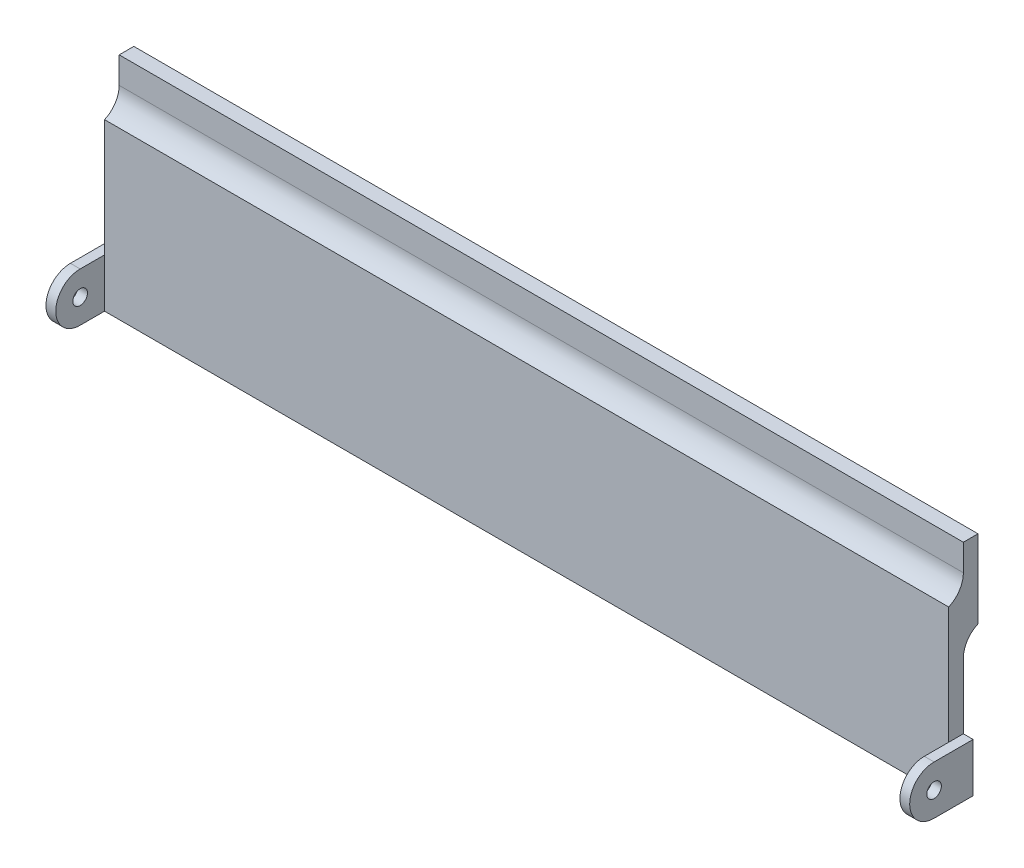
ISO-10303-21;
HEADER;
FILE_DESCRIPTION(('STEP AP214'),'2;1');
FILE_NAME('part.step','',(''),(''),'','','');
FILE_SCHEMA(('AUTOMOTIVE_DESIGN { 1 0 10303 214 1 1 1 1 }'));
ENDSEC;
DATA;
#1=APPLICATION_CONTEXT('core data for automotive mechanical design processes');
#2=APPLICATION_PROTOCOL_DEFINITION('international standard','automotive_design',2000,#1);
#3=PRODUCT_CONTEXT('',#1,'mechanical');
#4=PRODUCT('Part','Part','',(#3));
#5=PRODUCT_RELATED_PRODUCT_CATEGORY('part','',(#4));
#6=PRODUCT_DEFINITION_FORMATION('','',#4);
#7=PRODUCT_DEFINITION_CONTEXT('part definition',#1,'design');
#8=PRODUCT_DEFINITION('design','',#6,#7);
#9=PRODUCT_DEFINITION_SHAPE('','',#8);
#10=(LENGTH_UNIT() NAMED_UNIT(*) SI_UNIT(.MILLI.,.METRE.));
#11=(NAMED_UNIT(*) PLANE_ANGLE_UNIT() SI_UNIT($,.RADIAN.));
#12=(NAMED_UNIT(*) SI_UNIT($,.STERADIAN.) SOLID_ANGLE_UNIT());
#13=UNCERTAINTY_MEASURE_WITH_UNIT(LENGTH_MEASURE(1.E-05),#10,'distance_accuracy_value','');
#14=(GEOMETRIC_REPRESENTATION_CONTEXT(3) GLOBAL_UNCERTAINTY_ASSIGNED_CONTEXT((#13)) GLOBAL_UNIT_ASSIGNED_CONTEXT((#10,
#11,#12)) REPRESENTATION_CONTEXT('',''));
#15=CARTESIAN_POINT('',(0.,0.,0.));
#16=DIRECTION('',(0.,0.,1.));
#17=DIRECTION('',(1.,0.,0.));
#18=AXIS2_PLACEMENT_3D('',#15,#16,#17);
#19=CARTESIAN_POINT('',(86.5,-21.5,3.));
#20=DIRECTION('',(-1.,0.,0.));
#21=DIRECTION('',(0.,0.,1.));
#22=AXIS2_PLACEMENT_3D('',#19,#20,#21);
#23=PLANE('',#22);
#24=DIRECTION('',(0.,0.,1.));
#25=VECTOR('',#24,1.);
#26=CARTESIAN_POINT('',(86.5,-11.5,0.));
#27=LINE('',#26,#25);
#28=CARTESIAN_POINT('',(86.5,-11.5,0.));
#29=VERTEX_POINT('',#28);
#30=CARTESIAN_POINT('',(86.5,-11.5,3.));
#31=VERTEX_POINT('',#30);
#32=EDGE_CURVE('E260',#29,#31,#27,.T.);
#33=ORIENTED_EDGE('',*,*,#32,.F.);
#34=DIRECTION('',(0.,1.,0.));
#35=VECTOR('',#34,1.);
#36=CARTESIAN_POINT('',(86.5,-21.5,0.));
#37=LINE('',#36,#35);
#38=CARTESIAN_POINT('',(86.5,1.91742430504416,0.));
#39=VERTEX_POINT('',#38);
#40=EDGE_CURVE('E188',#29,#39,#37,.T.);
#41=ORIENTED_EDGE('',*,*,#40,.T.);
#42=CARTESIAN_POINT('',(86.5,1.91742430504417,-5.));
#43=DIRECTION('',(-1.,0.,0.));
#44=DIRECTION('',(0.,0.,1.));
#45=AXIS2_PLACEMENT_3D('',#42,#43,#44);
#46=CIRCLE('',#45,5.);
#47=CARTESIAN_POINT('',(86.5,6.50000000000001,-3.));
#48=VERTEX_POINT('',#47);
#49=EDGE_CURVE('E183',#39,#48,#46,.T.);
#50=ORIENTED_EDGE('',*,*,#49,.T.);
#51=DIRECTION('',(0.,-1.,0.));
#52=VECTOR('',#51,1.);
#53=CARTESIAN_POINT('',(86.5,6.50000000000001,-3.));
#54=LINE('',#53,#52);
#55=CARTESIAN_POINT('',(86.5,22.5,-3.));
#56=VERTEX_POINT('',#55);
#57=EDGE_CURVE('E186',#56,#48,#54,.T.);
#58=ORIENTED_EDGE('',*,*,#57,.F.);
#59=DIRECTION('',(0.,0.,1.));
#60=VECTOR('',#59,1.);
#61=CARTESIAN_POINT('',(86.5,22.5,-3.));
#62=LINE('',#61,#60);
#63=CARTESIAN_POINT('',(86.5,22.5,0.));
#64=VERTEX_POINT('',#63);
#65=EDGE_CURVE('E215',#56,#64,#62,.T.);
#66=ORIENTED_EDGE('',*,*,#65,.T.);
#67=DIRECTION('',(0.,-1.,0.));
#68=VECTOR('',#67,1.);
#69=CARTESIAN_POINT('',(86.5,6.50000000000001,0.));
#70=LINE('',#69,#68);
#71=CARTESIAN_POINT('',(86.5,17.0825756949558,0.));
#72=VERTEX_POINT('',#71);
#73=EDGE_CURVE('E216',#64,#72,#70,.T.);
#74=ORIENTED_EDGE('',*,*,#73,.T.);
#75=CARTESIAN_POINT('',(86.5,17.0825756949558,5.));
#76=DIRECTION('',(-1.,0.,0.));
#77=DIRECTION('',(0.,0.,1.));
#78=AXIS2_PLACEMENT_3D('',#75,#76,#77);
#79=CIRCLE('',#78,5.);
#80=CARTESIAN_POINT('',(86.5,12.5,3.));
#81=VERTEX_POINT('',#80);
#82=EDGE_CURVE('E12',#72,#81,#79,.T.);
#83=ORIENTED_EDGE('',*,*,#82,.T.);
#84=DIRECTION('',(0.,1.,0.));
#85=VECTOR('',#84,1.);
#86=CARTESIAN_POINT('',(86.5,-21.5,3.));
#87=LINE('',#86,#85);
#88=EDGE_CURVE('E329',#31,#81,#87,.T.);
#89=ORIENTED_EDGE('',*,*,#88,.F.);
#90=EDGE_LOOP('',(#33,#41,#50,#58,#66,#74,#83,#89));
#91=FACE_BOUND('',#90,.T.);
#92=ADVANCED_FACE('F75',(#91),#23,.F.);
#93=CARTESIAN_POINT('',(-86.5,-21.5,3.));
#94=DIRECTION('',(1.,0.,0.));
#95=DIRECTION('',(0.,0.,-1.));
#96=AXIS2_PLACEMENT_3D('',#93,#94,#95);
#97=PLANE('',#96);
#98=DIRECTION('',(0.,-1.,0.));
#99=VECTOR('',#98,1.);
#100=CARTESIAN_POINT('',(-86.5,-21.5,3.));
#101=LINE('',#100,#99);
#102=CARTESIAN_POINT('',(-86.5,12.5,3.));
#103=VERTEX_POINT('',#102);
#104=CARTESIAN_POINT('',(-86.5,-11.5,3.));
#105=VERTEX_POINT('',#104);
#106=EDGE_CURVE('E334',#103,#105,#101,.T.);
#107=ORIENTED_EDGE('',*,*,#106,.F.);
#108=CARTESIAN_POINT('',(-86.5,17.0825756949558,5.));
#109=DIRECTION('',(1.,0.,0.));
#110=DIRECTION('',(0.,0.,-1.));
#111=AXIS2_PLACEMENT_3D('',#108,#109,#110);
#112=CIRCLE('',#111,5.);
#113=CARTESIAN_POINT('',(-86.5,17.0825756949558,0.));
#114=VERTEX_POINT('',#113);
#115=EDGE_CURVE('E84',#103,#114,#112,.T.);
#116=ORIENTED_EDGE('',*,*,#115,.T.);
#117=DIRECTION('',(0.,1.,0.));
#118=VECTOR('',#117,1.);
#119=CARTESIAN_POINT('',(-86.5,6.5,0.));
#120=LINE('',#119,#118);
#121=CARTESIAN_POINT('',(-86.5,22.5,0.));
#122=VERTEX_POINT('',#121);
#123=EDGE_CURVE('E219',#114,#122,#120,.T.);
#124=ORIENTED_EDGE('',*,*,#123,.T.);
#125=DIRECTION('',(0.,0.,1.));
#126=VECTOR('',#125,1.);
#127=CARTESIAN_POINT('',(-86.5,22.5,-3.));
#128=LINE('',#127,#126);
#129=CARTESIAN_POINT('',(-86.5,22.5,-3.));
#130=VERTEX_POINT('',#129);
#131=EDGE_CURVE('E226',#130,#122,#128,.T.);
#132=ORIENTED_EDGE('',*,*,#131,.F.);
#133=DIRECTION('',(0.,1.,0.));
#134=VECTOR('',#133,1.);
#135=CARTESIAN_POINT('',(-86.5,6.5,-3.));
#136=LINE('',#135,#134);
#137=CARTESIAN_POINT('',(-86.5,6.5,-3.));
#138=VERTEX_POINT('',#137);
#139=EDGE_CURVE('E208',#138,#130,#136,.T.);
#140=ORIENTED_EDGE('',*,*,#139,.F.);
#141=CARTESIAN_POINT('',(-86.5,1.91742430504416,-5.));
#142=DIRECTION('',(1.,0.,0.));
#143=DIRECTION('',(0.,0.,-1.));
#144=AXIS2_PLACEMENT_3D('',#141,#142,#143);
#145=CIRCLE('',#144,5.);
#146=CARTESIAN_POINT('',(-86.5,1.91742430504416,0.));
#147=VERTEX_POINT('',#146);
#148=EDGE_CURVE('E193',#138,#147,#145,.T.);
#149=ORIENTED_EDGE('',*,*,#148,.T.);
#150=DIRECTION('',(0.,-1.,0.));
#151=VECTOR('',#150,1.);
#152=CARTESIAN_POINT('',(-86.5,-21.5,0.));
#153=LINE('',#152,#151);
#154=CARTESIAN_POINT('',(-86.5,-11.5,0.));
#155=VERTEX_POINT('',#154);
#156=EDGE_CURVE('E344',#147,#155,#153,.T.);
#157=ORIENTED_EDGE('',*,*,#156,.T.);
#158=DIRECTION('',(0.,0.,1.));
#159=VECTOR('',#158,1.);
#160=CARTESIAN_POINT('',(-86.5,-11.5,0.));
#161=LINE('',#160,#159);
#162=EDGE_CURVE('E300',#155,#105,#161,.T.);
#163=ORIENTED_EDGE('',*,*,#162,.T.);
#164=EDGE_LOOP('',(#107,#116,#124,#132,#140,#149,#157,#163));
#165=FACE_BOUND('',#164,.T.);
#166=ADVANCED_FACE('F386',(#165),#97,.F.);
#167=CARTESIAN_POINT('',(-86.5,-21.5,3.));
#168=DIRECTION('',(0.,1.,0.));
#169=DIRECTION('',(0.,0.,1.));
#170=AXIS2_PLACEMENT_3D('',#167,#168,#169);
#171=PLANE('',#170);
#172=DIRECTION('',(1.,0.,0.));
#173=VECTOR('',#172,1.);
#174=CARTESIAN_POINT('',(-86.5,-21.5,0.));
#175=LINE('',#174,#173);
#176=CARTESIAN_POINT('',(-88.5,-21.5,0.));
#177=VERTEX_POINT('',#176);
#178=CARTESIAN_POINT('',(88.5,-21.5,0.));
#179=VERTEX_POINT('',#178);
#180=EDGE_CURVE('E347',#177,#179,#175,.T.);
#181=ORIENTED_EDGE('',*,*,#180,.T.);
#182=DIRECTION('',(0.,0.,1.));
#183=VECTOR('',#182,1.);
#184=CARTESIAN_POINT('',(88.5,-21.5,0.));
#185=LINE('',#184,#183);
#186=CARTESIAN_POINT('',(88.5,-21.5,8.));
#187=VERTEX_POINT('',#186);
#188=EDGE_CURVE('E251',#179,#187,#185,.T.);
#189=ORIENTED_EDGE('',*,*,#188,.T.);
#190=DIRECTION('',(-1.,0.,0.));
#191=VECTOR('',#190,1.);
#192=CARTESIAN_POINT('',(88.5,-21.5,8.));
#193=LINE('',#192,#191);
#194=CARTESIAN_POINT('',(86.5,-21.5,8.));
#195=VERTEX_POINT('',#194);
#196=EDGE_CURVE('E270',#187,#195,#193,.T.);
#197=ORIENTED_EDGE('',*,*,#196,.T.);
#198=DIRECTION('',(0.,0.,1.));
#199=VECTOR('',#198,1.);
#200=CARTESIAN_POINT('',(86.5,-21.5,0.));
#201=LINE('',#200,#199);
#202=CARTESIAN_POINT('',(86.5,-21.5,3.));
#203=VERTEX_POINT('',#202);
#204=EDGE_CURVE('E252',#203,#195,#201,.T.);
#205=ORIENTED_EDGE('',*,*,#204,.F.);
#206=DIRECTION('',(1.,0.,0.));
#207=VECTOR('',#206,1.);
#208=CARTESIAN_POINT('',(-86.5,-21.5,3.));
#209=LINE('',#208,#207);
#210=CARTESIAN_POINT('',(-86.5,-21.5,3.));
#211=VERTEX_POINT('',#210);
#212=EDGE_CURVE('E338',#211,#203,#209,.T.);
#213=ORIENTED_EDGE('',*,*,#212,.F.);
#214=DIRECTION('',(0.,0.,1.));
#215=VECTOR('',#214,1.);
#216=CARTESIAN_POINT('',(-86.5,-21.5,0.));
#217=LINE('',#216,#215);
#218=CARTESIAN_POINT('',(-86.5,-21.5,8.));
#219=VERTEX_POINT('',#218);
#220=EDGE_CURVE('E291',#211,#219,#217,.T.);
#221=ORIENTED_EDGE('',*,*,#220,.T.);
#222=DIRECTION('',(1.,0.,0.));
#223=VECTOR('',#222,1.);
#224=CARTESIAN_POINT('',(-88.5,-21.5,8.));
#225=LINE('',#224,#223);
#226=CARTESIAN_POINT('',(-88.5,-21.5,8.));
#227=VERTEX_POINT('',#226);
#228=EDGE_CURVE('E311',#227,#219,#225,.T.);
#229=ORIENTED_EDGE('',*,*,#228,.F.);
#230=DIRECTION('',(0.,0.,1.));
#231=VECTOR('',#230,1.);
#232=CARTESIAN_POINT('',(-88.5,-21.5,0.));
#233=LINE('',#232,#231);
#234=EDGE_CURVE('E290',#177,#227,#233,.T.);
#235=ORIENTED_EDGE('',*,*,#234,.F.);
#236=EDGE_LOOP('',(#181,#189,#197,#205,#213,#221,#229,#235));
#237=FACE_BOUND('',#236,.T.);
#238=ADVANCED_FACE('F376',(#237),#171,.F.);
#239=CARTESIAN_POINT('',(0.,0.,3.));
#240=DIRECTION('',(0.,0.,-1.));
#241=DIRECTION('',(-1.,0.,0.));
#242=AXIS2_PLACEMENT_3D('',#239,#240,#241);
#243=PLANE('',#242);
#244=EDGE_CURVE('E325',#203,#31,#87,.T.);
#245=ORIENTED_EDGE('',*,*,#244,.T.);
#246=ORIENTED_EDGE('',*,*,#88,.T.);
#247=DIRECTION('',(-1.,0.,0.));
#248=VECTOR('',#247,1.);
#249=CARTESIAN_POINT('',(-86.5,12.5,3.));
#250=LINE('',#249,#248);
#251=EDGE_CURVE('E328',#81,#103,#250,.T.);
#252=ORIENTED_EDGE('',*,*,#251,.T.);
#253=ORIENTED_EDGE('',*,*,#106,.T.);
#254=EDGE_CURVE('E333',#105,#211,#101,.T.);
#255=ORIENTED_EDGE('',*,*,#254,.T.);
#256=ORIENTED_EDGE('',*,*,#212,.T.);
#257=EDGE_LOOP('',(#245,#246,#252,#253,#255,#256));
#258=FACE_BOUND('',#257,.T.);
#259=ADVANCED_FACE('F397',(#258),#243,.F.);
#260=CARTESIAN_POINT('',(0.,0.,0.));
#261=DIRECTION('',(0.,0.,-1.));
#262=DIRECTION('',(-1.,0.,0.));
#263=AXIS2_PLACEMENT_3D('',#260,#261,#262);
#264=PLANE('',#263);
#265=ORIENTED_EDGE('',*,*,#156,.F.);
#266=DIRECTION('',(-1.,0.,0.));
#267=VECTOR('',#266,1.);
#268=CARTESIAN_POINT('',(86.5,1.91742430504417,0.));
#269=LINE('',#268,#267);
#270=EDGE_CURVE('E341',#147,#39,#269,.F.);
#271=ORIENTED_EDGE('',*,*,#270,.T.);
#272=ORIENTED_EDGE('',*,*,#40,.F.);
#273=DIRECTION('',(-1.,0.,0.));
#274=VECTOR('',#273,1.);
#275=CARTESIAN_POINT('',(88.5,-11.5,0.));
#276=LINE('',#275,#274);
#277=CARTESIAN_POINT('',(88.5,-11.5,0.));
#278=VERTEX_POINT('',#277);
#279=EDGE_CURVE('E259',#278,#29,#276,.T.);
#280=ORIENTED_EDGE('',*,*,#279,.F.);
#281=DIRECTION('',(0.,1.,0.));
#282=VECTOR('',#281,1.);
#283=CARTESIAN_POINT('',(88.5,-21.5,0.));
#284=LINE('',#283,#282);
#285=EDGE_CURVE('E256',#179,#278,#284,.T.);
#286=ORIENTED_EDGE('',*,*,#285,.F.);
#287=ORIENTED_EDGE('',*,*,#180,.F.);
#288=DIRECTION('',(0.,1.,0.));
#289=VECTOR('',#288,1.);
#290=CARTESIAN_POINT('',(-88.5,-21.5,0.));
#291=LINE('',#290,#289);
#292=CARTESIAN_POINT('',(-88.5,-11.5,0.));
#293=VERTEX_POINT('',#292);
#294=EDGE_CURVE('E295',#177,#293,#291,.T.);
#295=ORIENTED_EDGE('',*,*,#294,.T.);
#296=DIRECTION('',(1.,0.,0.));
#297=VECTOR('',#296,1.);
#298=CARTESIAN_POINT('',(-88.5,-11.5,0.));
#299=LINE('',#298,#297);
#300=EDGE_CURVE('E307',#293,#155,#299,.T.);
#301=ORIENTED_EDGE('',*,*,#300,.T.);
#302=EDGE_LOOP('',(#265,#271,#272,#280,#286,#287,#295,#301));
#303=FACE_BOUND('',#302,.T.);
#304=ADVANCED_FACE('F384',(#303),#264,.T.);
#305=CARTESIAN_POINT('',(-88.5,-11.5,0.));
#306=DIRECTION('',(0.,1.,0.));
#307=DIRECTION('',(0.,0.,1.));
#308=AXIS2_PLACEMENT_3D('',#305,#306,#307);
#309=PLANE('',#308);
#310=ORIENTED_EDGE('',*,*,#162,.F.);
#311=ORIENTED_EDGE('',*,*,#300,.F.);
#312=DIRECTION('',(0.,0.,1.));
#313=VECTOR('',#312,1.);
#314=CARTESIAN_POINT('',(-88.5,-11.5,0.));
#315=LINE('',#314,#313);
#316=CARTESIAN_POINT('',(-88.5,-11.5,8.));
#317=VERTEX_POINT('',#316);
#318=EDGE_CURVE('E286',#293,#317,#315,.T.);
#319=ORIENTED_EDGE('',*,*,#318,.T.);
#320=DIRECTION('',(1.,0.,0.));
#321=VECTOR('',#320,1.);
#322=CARTESIAN_POINT('',(-88.5,-11.5,8.));
#323=LINE('',#322,#321);
#324=CARTESIAN_POINT('',(-86.5,-11.5,8.));
#325=VERTEX_POINT('',#324);
#326=EDGE_CURVE('E299',#317,#325,#323,.T.);
#327=ORIENTED_EDGE('',*,*,#326,.T.);
#328=EDGE_CURVE('E304',#105,#325,#161,.T.);
#329=ORIENTED_EDGE('',*,*,#328,.F.);
#330=EDGE_LOOP('',(#310,#311,#319,#327,#329));
#331=FACE_BOUND('',#330,.T.);
#332=ADVANCED_FACE('F407',(#331),#309,.T.);
#333=CARTESIAN_POINT('',(-86.5,0.,0.));
#334=DIRECTION('',(-1.,0.,0.));
#335=DIRECTION('',(0.,0.,1.));
#336=AXIS2_PLACEMENT_3D('',#333,#334,#335);
#337=PLANE('',#336);
#338=CARTESIAN_POINT('',(-86.5,-16.5,8.));
#339=DIRECTION('',(-1.,0.,0.));
#340=DIRECTION('',(0.,0.,1.));
#341=AXIS2_PLACEMENT_3D('',#338,#339,#340);
#342=CIRCLE('',#341,1.5);
#343=CARTESIAN_POINT('',(-86.5,-16.5,9.5));
#344=VERTEX_POINT('',#343);
#345=EDGE_CURVE('E242',#344,#344,#342,.T.);
#346=ORIENTED_EDGE('',*,*,#345,.T.);
#347=EDGE_LOOP('',(#346));
#348=FACE_BOUND('',#347,.T.);
#349=ORIENTED_EDGE('',*,*,#254,.F.);
#350=ORIENTED_EDGE('',*,*,#328,.T.);
#351=CARTESIAN_POINT('',(-86.5,-16.5,8.));
#352=DIRECTION('',(-1.,0.,0.));
#353=DIRECTION('',(0.,0.,1.));
#354=AXIS2_PLACEMENT_3D('',#351,#352,#353);
#355=CIRCLE('',#354,5.);
#356=EDGE_CURVE('E278',#219,#325,#355,.T.);
#357=ORIENTED_EDGE('',*,*,#356,.F.);
#358=ORIENTED_EDGE('',*,*,#220,.F.);
#359=EDGE_LOOP('',(#349,#350,#357,#358));
#360=FACE_BOUND('',#359,.T.);
#361=ADVANCED_FACE('F405',(#348,#360),#337,.F.);
#362=CARTESIAN_POINT('',(-88.5,0.,0.));
#363=DIRECTION('',(-1.,0.,0.));
#364=DIRECTION('',(0.,0.,1.));
#365=AXIS2_PLACEMENT_3D('',#362,#363,#364);
#366=PLANE('',#365);
#367=CARTESIAN_POINT('',(-88.5,-16.5,8.));
#368=DIRECTION('',(-1.,0.,0.));
#369=DIRECTION('',(0.,0.,1.));
#370=AXIS2_PLACEMENT_3D('',#367,#368,#369);
#371=CIRCLE('',#370,1.5);
#372=CARTESIAN_POINT('',(-88.5,-16.5,9.5));
#373=VERTEX_POINT('',#372);
#374=EDGE_CURVE('E238',#373,#373,#371,.T.);
#375=ORIENTED_EDGE('',*,*,#374,.F.);
#376=EDGE_LOOP('',(#375));
#377=FACE_BOUND('',#376,.T.);
#378=ORIENTED_EDGE('',*,*,#234,.T.);
#379=CARTESIAN_POINT('',(-88.5,-16.5,8.));
#380=DIRECTION('',(-1.,0.,0.));
#381=DIRECTION('',(0.,0.,1.));
#382=AXIS2_PLACEMENT_3D('',#379,#380,#381);
#383=CIRCLE('',#382,5.);
#384=EDGE_CURVE('E318',#227,#317,#383,.T.);
#385=ORIENTED_EDGE('',*,*,#384,.T.);
#386=ORIENTED_EDGE('',*,*,#318,.F.);
#387=ORIENTED_EDGE('',*,*,#294,.F.);
#388=EDGE_LOOP('',(#378,#385,#386,#387));
#389=FACE_BOUND('',#388,.T.);
#390=ADVANCED_FACE('F410',(#377,#389),#366,.T.);
#391=CARTESIAN_POINT('',(-88.5,-16.5,8.));
#392=DIRECTION('',(1.,0.,0.));
#393=DIRECTION('',(0.,0.,-1.));
#394=AXIS2_PLACEMENT_3D('',#391,#392,#393);
#395=CYLINDRICAL_SURFACE('',#394,5.);
#396=ORIENTED_EDGE('',*,*,#356,.T.);
#397=ORIENTED_EDGE('',*,*,#326,.F.);
#398=ORIENTED_EDGE('',*,*,#384,.F.);
#399=ORIENTED_EDGE('',*,*,#228,.T.);
#400=EDGE_LOOP('',(#396,#397,#398,#399));
#401=FACE_BOUND('',#400,.T.);
#402=ADVANCED_FACE('F404',(#401),#395,.T.);
#403=CARTESIAN_POINT('',(86.5,0.,0.));
#404=DIRECTION('',(-1.,0.,0.));
#405=DIRECTION('',(0.,0.,1.));
#406=AXIS2_PLACEMENT_3D('',#403,#404,#405);
#407=PLANE('',#406);
#408=CARTESIAN_POINT('',(86.5,-16.5,8.));
#409=DIRECTION('',(-1.,0.,0.));
#410=DIRECTION('',(0.,0.,1.));
#411=AXIS2_PLACEMENT_3D('',#408,#409,#410);
#412=CIRCLE('',#411,1.5);
#413=CARTESIAN_POINT('',(86.5,-16.5,9.5));
#414=VERTEX_POINT('',#413);
#415=EDGE_CURVE('E234',#414,#414,#412,.T.);
#416=ORIENTED_EDGE('',*,*,#415,.F.);
#417=EDGE_LOOP('',(#416));
#418=FACE_BOUND('',#417,.T.);
#419=ORIENTED_EDGE('',*,*,#244,.F.);
#420=ORIENTED_EDGE('',*,*,#204,.T.);
#421=CARTESIAN_POINT('',(86.5,-16.5,8.));
#422=DIRECTION('',(1.,0.,0.));
#423=DIRECTION('',(0.,0.,-1.));
#424=AXIS2_PLACEMENT_3D('',#421,#422,#423);
#425=CIRCLE('',#424,4.99999999999998);
#426=CARTESIAN_POINT('',(86.5,-11.5,8.));
#427=VERTEX_POINT('',#426);
#428=EDGE_CURVE('E246',#427,#195,#425,.T.);
#429=ORIENTED_EDGE('',*,*,#428,.F.);
#430=EDGE_CURVE('E264',#31,#427,#27,.T.);
#431=ORIENTED_EDGE('',*,*,#430,.F.);
#432=EDGE_LOOP('',(#419,#420,#429,#431));
#433=FACE_BOUND('',#432,.T.);
#434=ADVANCED_FACE('F372',(#418,#433),#407,.T.);
#435=CARTESIAN_POINT('',(88.5,-11.5,0.));
#436=DIRECTION('',(0.,-1.,0.));
#437=DIRECTION('',(0.,0.,-1.));
#438=AXIS2_PLACEMENT_3D('',#435,#436,#437);
#439=PLANE('',#438);
#440=ORIENTED_EDGE('',*,*,#32,.T.);
#441=ORIENTED_EDGE('',*,*,#430,.T.);
#442=DIRECTION('',(-1.,0.,0.));
#443=VECTOR('',#442,1.);
#444=CARTESIAN_POINT('',(88.5,-11.5,8.));
#445=LINE('',#444,#443);
#446=CARTESIAN_POINT('',(88.5,-11.5,8.));
#447=VERTEX_POINT('',#446);
#448=EDGE_CURVE('E274',#447,#427,#445,.T.);
#449=ORIENTED_EDGE('',*,*,#448,.F.);
#450=DIRECTION('',(0.,0.,1.));
#451=VECTOR('',#450,1.);
#452=CARTESIAN_POINT('',(88.5,-11.5,0.));
#453=LINE('',#452,#451);
#454=EDGE_CURVE('E247',#278,#447,#453,.T.);
#455=ORIENTED_EDGE('',*,*,#454,.F.);
#456=ORIENTED_EDGE('',*,*,#279,.T.);
#457=EDGE_LOOP('',(#440,#441,#449,#455,#456));
#458=FACE_BOUND('',#457,.T.);
#459=ADVANCED_FACE('F364',(#458),#439,.F.);
#460=CARTESIAN_POINT('',(88.5,0.,0.));
#461=DIRECTION('',(-1.,0.,0.));
#462=DIRECTION('',(0.,0.,1.));
#463=AXIS2_PLACEMENT_3D('',#460,#461,#462);
#464=PLANE('',#463);
#465=CARTESIAN_POINT('',(88.5,-16.5,8.));
#466=DIRECTION('',(1.,0.,0.));
#467=DIRECTION('',(0.,0.,-1.));
#468=AXIS2_PLACEMENT_3D('',#465,#466,#467);
#469=CIRCLE('',#468,1.5);
#470=CARTESIAN_POINT('',(88.5,-16.5,6.5));
#471=VERTEX_POINT('',#470);
#472=EDGE_CURVE('E230',#471,#471,#469,.T.);
#473=ORIENTED_EDGE('',*,*,#472,.F.);
#474=EDGE_LOOP('',(#473));
#475=FACE_BOUND('',#474,.T.);
#476=ORIENTED_EDGE('',*,*,#454,.T.);
#477=CARTESIAN_POINT('',(88.5,-16.5,8.));
#478=DIRECTION('',(1.,0.,0.));
#479=DIRECTION('',(0.,0.,-1.));
#480=AXIS2_PLACEMENT_3D('',#477,#478,#479);
#481=CIRCLE('',#480,4.99999999999998);
#482=EDGE_CURVE('E279',#447,#187,#481,.T.);
#483=ORIENTED_EDGE('',*,*,#482,.T.);
#484=ORIENTED_EDGE('',*,*,#188,.F.);
#485=ORIENTED_EDGE('',*,*,#285,.T.);
#486=EDGE_LOOP('',(#476,#483,#484,#485));
#487=FACE_BOUND('',#486,.T.);
#488=ADVANCED_FACE('F379',(#475,#487),#464,.F.);
#489=CARTESIAN_POINT('',(88.5,-16.5,8.));
#490=DIRECTION('',(-1.,0.,0.));
#491=DIRECTION('',(0.,0.,1.));
#492=AXIS2_PLACEMENT_3D('',#489,#490,#491);
#493=CYLINDRICAL_SURFACE('',#492,4.99999999999998);
#494=ORIENTED_EDGE('',*,*,#448,.T.);
#495=ORIENTED_EDGE('',*,*,#428,.T.);
#496=ORIENTED_EDGE('',*,*,#196,.F.);
#497=ORIENTED_EDGE('',*,*,#482,.F.);
#498=EDGE_LOOP('',(#494,#495,#496,#497));
#499=FACE_BOUND('',#498,.T.);
#500=ADVANCED_FACE('F371',(#499),#493,.T.);
#501=CARTESIAN_POINT('',(-111.5,-16.5,8.));
#502=DIRECTION('',(1.,0.,0.));
#503=DIRECTION('',(0.,0.,-1.));
#504=AXIS2_PLACEMENT_3D('',#501,#502,#503);
#505=CYLINDRICAL_SURFACE('',#504,1.5);
#506=ORIENTED_EDGE('',*,*,#415,.T.);
#507=EDGE_LOOP('',(#506));
#508=FACE_BOUND('',#507,.T.);
#509=ORIENTED_EDGE('',*,*,#472,.T.);
#510=EDGE_LOOP('',(#509));
#511=FACE_BOUND('',#510,.T.);
#512=ADVANCED_FACE('F446',(#508,#511),#505,.F.);
#513=ORIENTED_EDGE('',*,*,#374,.T.);
#514=EDGE_LOOP('',(#513));
#515=FACE_BOUND('',#514,.T.);
#516=ORIENTED_EDGE('',*,*,#345,.F.);
#517=EDGE_LOOP('',(#516));
#518=FACE_BOUND('',#517,.T.);
#519=ADVANCED_FACE('F444',(#515,#518),#505,.F.);
#520=CARTESIAN_POINT('',(0.,0.,0.));
#521=DIRECTION('',(0.,0.,1.));
#522=DIRECTION('',(1.,0.,0.));
#523=AXIS2_PLACEMENT_3D('',#520,#521,#522);
#524=PLANE('',#523);
#525=ORIENTED_EDGE('',*,*,#123,.F.);
#526=DIRECTION('',(-1.,0.,0.));
#527=VECTOR('',#526,1.);
#528=CARTESIAN_POINT('',(86.5,17.0825756949558,0.));
#529=LINE('',#528,#527);
#530=EDGE_CURVE('E97',#114,#72,#529,.F.);
#531=ORIENTED_EDGE('',*,*,#530,.T.);
#532=ORIENTED_EDGE('',*,*,#73,.F.);
#533=DIRECTION('',(1.,0.,0.));
#534=VECTOR('',#533,1.);
#535=CARTESIAN_POINT('',(86.5,22.5,0.));
#536=LINE('',#535,#534);
#537=EDGE_CURVE('E204',#122,#64,#536,.T.);
#538=ORIENTED_EDGE('',*,*,#537,.F.);
#539=EDGE_LOOP('',(#525,#531,#532,#538));
#540=FACE_BOUND('',#539,.T.);
#541=ADVANCED_FACE('F392',(#540),#524,.T.);
#542=CARTESIAN_POINT('',(86.5,22.5,-3.));
#543=DIRECTION('',(0.,-1.,0.));
#544=DIRECTION('',(0.,0.,-1.));
#545=AXIS2_PLACEMENT_3D('',#542,#543,#544);
#546=PLANE('',#545);
#547=ORIENTED_EDGE('',*,*,#537,.T.);
#548=ORIENTED_EDGE('',*,*,#65,.F.);
#549=DIRECTION('',(1.,0.,0.));
#550=VECTOR('',#549,1.);
#551=CARTESIAN_POINT('',(86.5,22.5,-3.));
#552=LINE('',#551,#550);
#553=EDGE_CURVE('E201',#130,#56,#552,.T.);
#554=ORIENTED_EDGE('',*,*,#553,.F.);
#555=ORIENTED_EDGE('',*,*,#131,.T.);
#556=EDGE_LOOP('',(#547,#548,#554,#555));
#557=FACE_BOUND('',#556,.T.);
#558=ADVANCED_FACE('F390',(#557),#546,.F.);
#559=CARTESIAN_POINT('',(0.,0.,-3.));
#560=DIRECTION('',(0.,0.,1.));
#561=DIRECTION('',(1.,0.,0.));
#562=AXIS2_PLACEMENT_3D('',#559,#560,#561);
#563=PLANE('',#562);
#564=ORIENTED_EDGE('',*,*,#57,.T.);
#565=DIRECTION('',(-1.,0.,0.));
#566=VECTOR('',#565,1.);
#567=CARTESIAN_POINT('',(86.5,6.50000000000001,-3.));
#568=LINE('',#567,#566);
#569=EDGE_CURVE('E198',#48,#138,#568,.T.);
#570=ORIENTED_EDGE('',*,*,#569,.T.);
#571=ORIENTED_EDGE('',*,*,#139,.T.);
#572=ORIENTED_EDGE('',*,*,#553,.T.);
#573=EDGE_LOOP('',(#564,#570,#571,#572));
#574=FACE_BOUND('',#573,.T.);
#575=ADVANCED_FACE('F197',(#574),#563,.F.);
#576=CARTESIAN_POINT('',(86.5,1.91742430504417,-5.));
#577=DIRECTION('',(1.,0.,0.));
#578=DIRECTION('',(0.,1.,0.));
#579=AXIS2_PLACEMENT_3D('',#576,#577,#578);
#580=CYLINDRICAL_SURFACE('',#579,5.);
#581=ORIENTED_EDGE('',*,*,#49,.F.);
#582=ORIENTED_EDGE('',*,*,#270,.F.);
#583=ORIENTED_EDGE('',*,*,#148,.F.);
#584=ORIENTED_EDGE('',*,*,#569,.F.);
#585=EDGE_LOOP('',(#581,#582,#583,#584));
#586=FACE_BOUND('',#585,.T.);
#587=ADVANCED_FACE('F206',(#586),#580,.F.);
#588=CARTESIAN_POINT('',(-86.5,17.0825756949558,5.));
#589=DIRECTION('',(1.,0.,0.));
#590=DIRECTION('',(0.,0.,-1.));
#591=AXIS2_PLACEMENT_3D('',#588,#589,#590);
#592=CYLINDRICAL_SURFACE('',#591,5.);
#593=ORIENTED_EDGE('',*,*,#82,.F.);
#594=ORIENTED_EDGE('',*,*,#530,.F.);
#595=ORIENTED_EDGE('',*,*,#115,.F.);
#596=ORIENTED_EDGE('',*,*,#251,.F.);
#597=EDGE_LOOP('',(#593,#594,#595,#596));
#598=FACE_BOUND('',#597,.T.);
#599=ADVANCED_FACE('F77',(#598),#592,.F.);
#600=CLOSED_SHELL('',(#92,#166,#238,#259,#304,#332,#361,#390,#402,#434,#459,#488,#500,#512,#519,
#541,#558,#575,#587,#599));
#601=MANIFOLD_SOLID_BREP('B2',#600);
#602=ADVANCED_BREP_SHAPE_REPRESENTATION('',(#18,#601),#14);
#603=SHAPE_DEFINITION_REPRESENTATION(#9,#602);
ENDSEC;
END-ISO-10303-21;
